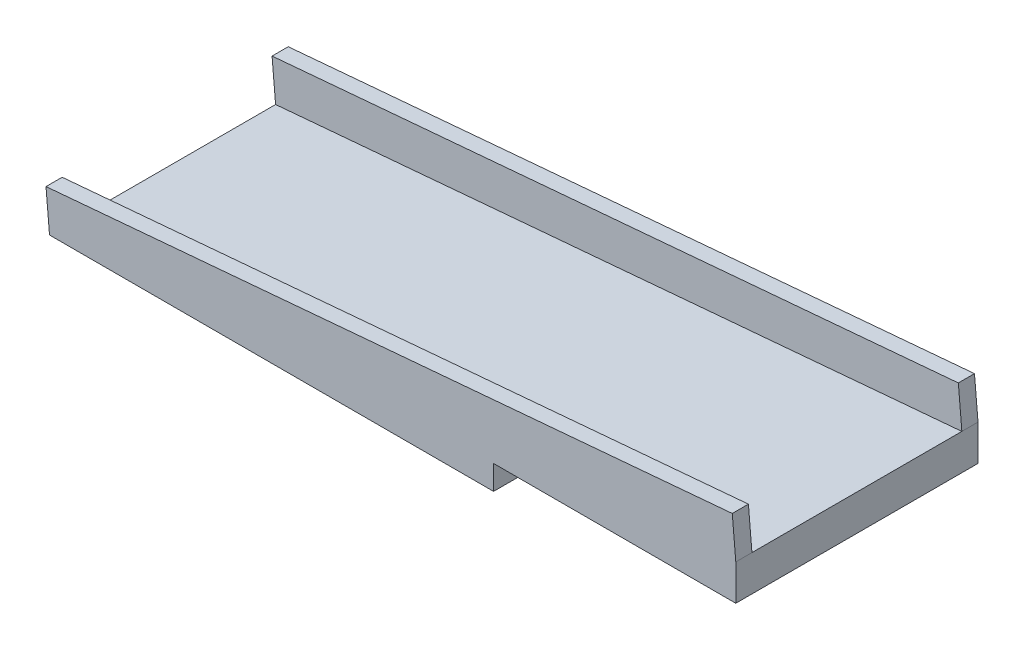
ISO-10303-21;
HEADER;
FILE_DESCRIPTION(('STEP AP214'),'2;1');
FILE_NAME('part.step','',(''),(''),'','','');
FILE_SCHEMA(('AUTOMOTIVE_DESIGN { 1 0 10303 214 1 1 1 1 }'));
ENDSEC;
DATA;
#1=APPLICATION_CONTEXT('core data for automotive mechanical design processes');
#2=APPLICATION_PROTOCOL_DEFINITION('international standard','automotive_design',2000,#1);
#3=PRODUCT_CONTEXT('',#1,'mechanical');
#4=PRODUCT('Part','Part','',(#3));
#5=PRODUCT_RELATED_PRODUCT_CATEGORY('part','',(#4));
#6=PRODUCT_DEFINITION_FORMATION('','',#4);
#7=PRODUCT_DEFINITION_CONTEXT('part definition',#1,'design');
#8=PRODUCT_DEFINITION('design','',#6,#7);
#9=PRODUCT_DEFINITION_SHAPE('','',#8);
#10=(LENGTH_UNIT() NAMED_UNIT(*) SI_UNIT(.MILLI.,.METRE.));
#11=(NAMED_UNIT(*) PLANE_ANGLE_UNIT() SI_UNIT($,.RADIAN.));
#12=(NAMED_UNIT(*) SI_UNIT($,.STERADIAN.) SOLID_ANGLE_UNIT());
#13=UNCERTAINTY_MEASURE_WITH_UNIT(LENGTH_MEASURE(1.E-05),#10,'distance_accuracy_value','');
#14=(GEOMETRIC_REPRESENTATION_CONTEXT(3) GLOBAL_UNCERTAINTY_ASSIGNED_CONTEXT((#13)) GLOBAL_UNIT_ASSIGNED_CONTEXT((#10,
#11,#12)) REPRESENTATION_CONTEXT('',''));
#15=CARTESIAN_POINT('',(0.,0.,0.));
#16=DIRECTION('',(0.,0.,1.));
#17=DIRECTION('',(1.,0.,0.));
#18=AXIS2_PLACEMENT_3D('',#15,#16,#17);
#19=CARTESIAN_POINT('',(-0.329025349508122,3.76077695381245,30.));
#20=DIRECTION('',(0.0871557427476515,-0.996194698091746,0.));
#21=DIRECTION('',(0.996194698091746,0.0871557427476515,0.));
#22=AXIS2_PLACEMENT_3D('',#19,#20,#21);
#23=PLANE('',#22);
#24=DIRECTION('',(0.996194698091746,0.0871557427476516,0.));
#25=VECTOR('',#24,1.);
#26=CARTESIAN_POINT('',(-43.3149026306073,0.,2.));
#27=LINE('',#26,#25);
#28=CARTESIAN_POINT('',(-43.3149026306072,0.,2.));
#29=VERTEX_POINT('',#28);
#30=CARTESIAN_POINT('',(41.6850973693928,7.43653639970297,2.));
#31=VERTEX_POINT('',#30);
#32=EDGE_CURVE('E63',#29,#31,#27,.T.);
#33=ORIENTED_EDGE('',*,*,#32,.F.);
#34=DIRECTION('',(0.,0.,-1.));
#35=VECTOR('',#34,1.);
#36=CARTESIAN_POINT('',(-43.3149026306072,0.,30.));
#37=LINE('',#36,#35);
#38=CARTESIAN_POINT('',(-43.3149026306073,0.,28.));
#39=VERTEX_POINT('',#38);
#40=EDGE_CURVE('E151',#39,#29,#37,.T.);
#41=ORIENTED_EDGE('',*,*,#40,.F.);
#42=DIRECTION('',(-0.996194698091746,-0.0871557427476516,0.));
#43=VECTOR('',#42,1.);
#44=CARTESIAN_POINT('',(-43.3149026306073,0.,28.));
#45=LINE('',#44,#43);
#46=CARTESIAN_POINT('',(41.6850973693928,7.43653639970297,28.));
#47=VERTEX_POINT('',#46);
#48=EDGE_CURVE('E156',#47,#39,#45,.T.);
#49=ORIENTED_EDGE('',*,*,#48,.F.);
#50=DIRECTION('',(0.,0.,-1.));
#51=VECTOR('',#50,1.);
#52=CARTESIAN_POINT('',(41.6850973693928,7.43653639970297,30.));
#53=LINE('',#52,#51);
#54=EDGE_CURVE('E240',#47,#31,#53,.T.);
#55=ORIENTED_EDGE('',*,*,#54,.T.);
#56=EDGE_LOOP('',(#33,#41,#49,#55));
#57=FACE_BOUND('',#56,.T.);
#58=ADVANCED_FACE('F47',(#57),#23,.F.);
#59=CARTESIAN_POINT('',(0.,0.,30.));
#60=DIRECTION('',(0.,1.,0.));
#61=DIRECTION('',(0.,0.,1.));
#62=AXIS2_PLACEMENT_3D('',#59,#60,#61);
#63=PLANE('',#62);
#64=DIRECTION('',(1.,0.,0.));
#65=VECTOR('',#64,1.);
#66=CARTESIAN_POINT('',(0.,0.,0.));
#67=LINE('',#66,#65);
#68=CARTESIAN_POINT('',(-43.3149026306073,0.,0.));
#69=VERTEX_POINT('',#68);
#70=CARTESIAN_POINT('',(11.6850973693928,0.,0.));
#71=VERTEX_POINT('',#70);
#72=EDGE_CURVE('E133',#69,#71,#67,.T.);
#73=ORIENTED_EDGE('',*,*,#72,.T.);
#74=DIRECTION('',(0.,0.,-1.));
#75=VECTOR('',#74,1.);
#76=CARTESIAN_POINT('',(11.6850973693928,0.,30.));
#77=LINE('',#76,#75);
#78=CARTESIAN_POINT('',(11.6850973693928,0.,30.));
#79=VERTEX_POINT('',#78);
#80=EDGE_CURVE('E11',#79,#71,#77,.T.);
#81=ORIENTED_EDGE('',*,*,#80,.F.);
#82=DIRECTION('',(1.,0.,0.));
#83=VECTOR('',#82,1.);
#84=CARTESIAN_POINT('',(0.,0.,30.));
#85=LINE('',#84,#83);
#86=CARTESIAN_POINT('',(-43.3149026306072,0.,30.));
#87=VERTEX_POINT('',#86);
#88=EDGE_CURVE('E214',#87,#79,#85,.T.);
#89=ORIENTED_EDGE('',*,*,#88,.F.);
#90=EDGE_CURVE('E237',#87,#39,#37,.T.);
#91=ORIENTED_EDGE('',*,*,#90,.T.);
#92=ORIENTED_EDGE('',*,*,#40,.T.);
#93=DIRECTION('',(0.,0.,1.));
#94=VECTOR('',#93,1.);
#95=CARTESIAN_POINT('',(-43.3149026306073,0.,0.));
#96=LINE('',#95,#94);
#97=EDGE_CURVE('E149',#69,#29,#96,.T.);
#98=ORIENTED_EDGE('',*,*,#97,.F.);
#99=EDGE_LOOP('',(#73,#81,#89,#91,#92,#98));
#100=FACE_BOUND('',#99,.T.);
#101=ADVANCED_FACE('F49',(#100),#63,.F.);
#102=CARTESIAN_POINT('',(11.6850973693928,0.,30.));
#103=DIRECTION('',(-1.,0.,0.));
#104=DIRECTION('',(0.,0.,1.));
#105=AXIS2_PLACEMENT_3D('',#102,#103,#104);
#106=PLANE('',#105);
#107=DIRECTION('',(0.,1.,0.));
#108=VECTOR('',#107,1.);
#109=CARTESIAN_POINT('',(11.6850973693928,0.,0.));
#110=LINE('',#109,#108);
#111=CARTESIAN_POINT('',(11.6850973693928,3.,0.));
#112=VERTEX_POINT('',#111);
#113=EDGE_CURVE('E142',#71,#112,#110,.T.);
#114=ORIENTED_EDGE('',*,*,#113,.T.);
#115=DIRECTION('',(0.,0.,-1.));
#116=VECTOR('',#115,1.);
#117=CARTESIAN_POINT('',(11.6850973693928,3.,30.));
#118=LINE('',#117,#116);
#119=CARTESIAN_POINT('',(11.6850973693928,3.,30.));
#120=VERTEX_POINT('',#119);
#121=EDGE_CURVE('E56',#120,#112,#118,.T.);
#122=ORIENTED_EDGE('',*,*,#121,.F.);
#123=DIRECTION('',(0.,1.,0.));
#124=VECTOR('',#123,1.);
#125=CARTESIAN_POINT('',(11.6850973693928,0.,30.));
#126=LINE('',#125,#124);
#127=EDGE_CURVE('E218',#79,#120,#126,.T.);
#128=ORIENTED_EDGE('',*,*,#127,.F.);
#129=ORIENTED_EDGE('',*,*,#80,.T.);
#130=EDGE_LOOP('',(#114,#122,#128,#129));
#131=FACE_BOUND('',#130,.T.);
#132=ADVANCED_FACE('F253',(#131),#106,.F.);
#133=CARTESIAN_POINT('',(0.,2.99999999999999,30.));
#134=DIRECTION('',(0.,-1.,0.));
#135=DIRECTION('',(1.,0.,0.));
#136=AXIS2_PLACEMENT_3D('',#133,#134,#135);
#137=PLANE('',#136);
#138=DIRECTION('',(-1.,0.,0.));
#139=VECTOR('',#138,1.);
#140=CARTESIAN_POINT('',(0.,2.99999999999999,0.));
#141=LINE('',#140,#139);
#142=CARTESIAN_POINT('',(41.6850973693928,3.,0.));
#143=VERTEX_POINT('',#142);
#144=EDGE_CURVE('E232',#143,#112,#141,.T.);
#145=ORIENTED_EDGE('',*,*,#144,.F.);
#146=DIRECTION('',(0.,0.,-1.));
#147=VECTOR('',#146,1.);
#148=CARTESIAN_POINT('',(41.6850973693928,3.,30.));
#149=LINE('',#148,#147);
#150=CARTESIAN_POINT('',(41.6850973693928,3.,30.));
#151=VERTEX_POINT('',#150);
#152=EDGE_CURVE('E244',#151,#143,#149,.T.);
#153=ORIENTED_EDGE('',*,*,#152,.F.);
#154=DIRECTION('',(-1.,0.,0.));
#155=VECTOR('',#154,1.);
#156=CARTESIAN_POINT('',(0.,2.99999999999999,30.));
#157=LINE('',#156,#155);
#158=EDGE_CURVE('E222',#151,#120,#157,.T.);
#159=ORIENTED_EDGE('',*,*,#158,.T.);
#160=ORIENTED_EDGE('',*,*,#121,.T.);
#161=EDGE_LOOP('',(#145,#153,#159,#160));
#162=FACE_BOUND('',#161,.T.);
#163=ADVANCED_FACE('F250',(#162),#137,.T.);
#164=CARTESIAN_POINT('',(41.6850973693928,0.,30.));
#165=DIRECTION('',(-1.,0.,0.));
#166=DIRECTION('',(0.,-1.,0.));
#167=AXIS2_PLACEMENT_3D('',#164,#165,#166);
#168=PLANE('',#167);
#169=DIRECTION('',(0.,1.,0.));
#170=VECTOR('',#169,1.);
#171=CARTESIAN_POINT('',(41.6850973693928,0.,0.));
#172=LINE('',#171,#170);
#173=CARTESIAN_POINT('',(41.6850973693928,7.43653639970297,0.));
#174=VERTEX_POINT('',#173);
#175=EDGE_CURVE('E219',#143,#174,#172,.T.);
#176=ORIENTED_EDGE('',*,*,#175,.T.);
#177=DIRECTION('',(0.,0.,-1.));
#178=VECTOR('',#177,1.);
#179=CARTESIAN_POINT('',(41.6850973693928,7.43653639970297,0.));
#180=LINE('',#179,#178);
#181=EDGE_CURVE('E71',#31,#174,#180,.T.);
#182=ORIENTED_EDGE('',*,*,#181,.F.);
#183=ORIENTED_EDGE('',*,*,#54,.F.);
#184=CARTESIAN_POINT('',(41.6850973693928,7.43653639970297,30.));
#185=VERTEX_POINT('',#184);
#186=EDGE_CURVE('E241',#185,#47,#53,.T.);
#187=ORIENTED_EDGE('',*,*,#186,.F.);
#188=DIRECTION('',(0.,1.,0.));
#189=VECTOR('',#188,1.);
#190=CARTESIAN_POINT('',(41.6850973693928,0.,30.));
#191=LINE('',#190,#189);
#192=EDGE_CURVE('E226',#151,#185,#191,.T.);
#193=ORIENTED_EDGE('',*,*,#192,.F.);
#194=ORIENTED_EDGE('',*,*,#152,.T.);
#195=EDGE_LOOP('',(#176,#182,#183,#187,#193,#194));
#196=FACE_BOUND('',#195,.T.);
#197=ADVANCED_FACE('F256',(#196),#168,.F.);
#198=CARTESIAN_POINT('',(0.,0.,30.));
#199=DIRECTION('',(0.,0.,1.));
#200=DIRECTION('',(1.,0.,0.));
#201=AXIS2_PLACEMENT_3D('',#198,#199,#200);
#202=PLANE('',#201);
#203=ORIENTED_EDGE('',*,*,#88,.T.);
#204=ORIENTED_EDGE('',*,*,#127,.T.);
#205=ORIENTED_EDGE('',*,*,#158,.F.);
#206=ORIENTED_EDGE('',*,*,#192,.T.);
#207=DIRECTION('',(0.0871557427476515,-0.996194698091746,0.));
#208=VECTOR('',#207,1.);
#209=CARTESIAN_POINT('',(41.2493186556545,12.4175098901617,30.));
#210=LINE('',#209,#208);
#211=CARTESIAN_POINT('',(41.2493186556545,12.4175098901617,30.));
#212=VERTEX_POINT('',#211);
#213=EDGE_CURVE('E208',#212,#185,#210,.T.);
#214=ORIENTED_EDGE('',*,*,#213,.F.);
#215=DIRECTION('',(0.996194698091746,0.0871557427476516,0.));
#216=VECTOR('',#215,1.);
#217=CARTESIAN_POINT('',(-43.7506813443455,4.98097349045873,30.));
#218=LINE('',#217,#216);
#219=CARTESIAN_POINT('',(-43.7506813443455,4.98097349045873,30.));
#220=VERTEX_POINT('',#219);
#221=EDGE_CURVE('E189',#220,#212,#218,.T.);
#222=ORIENTED_EDGE('',*,*,#221,.F.);
#223=DIRECTION('',(0.0871557427476515,-0.996194698091746,0.));
#224=VECTOR('',#223,1.);
#225=CARTESIAN_POINT('',(-43.7506813443455,4.98097349045873,30.));
#226=LINE('',#225,#224);
#227=EDGE_CURVE('E146',#220,#87,#226,.T.);
#228=ORIENTED_EDGE('',*,*,#227,.T.);
#229=EDGE_LOOP('',(#203,#204,#205,#206,#214,#222,#228));
#230=FACE_BOUND('',#229,.T.);
#231=ADVANCED_FACE('F289',(#230),#202,.T.);
#232=CARTESIAN_POINT('',(0.,0.,0.));
#233=DIRECTION('',(0.,0.,1.));
#234=DIRECTION('',(1.,0.,0.));
#235=AXIS2_PLACEMENT_3D('',#232,#233,#234);
#236=PLANE('',#235);
#237=ORIENTED_EDGE('',*,*,#72,.F.);
#238=DIRECTION('',(0.0871557427476515,-0.996194698091746,0.));
#239=VECTOR('',#238,1.);
#240=CARTESIAN_POINT('',(-43.7506813443455,4.98097349045873,0.));
#241=LINE('',#240,#239);
#242=CARTESIAN_POINT('',(-43.7506813443455,4.98097349045873,0.));
#243=VERTEX_POINT('',#242);
#244=EDGE_CURVE('E138',#243,#69,#241,.T.);
#245=ORIENTED_EDGE('',*,*,#244,.F.);
#246=DIRECTION('',(-0.996194698091746,-0.0871557427476516,0.));
#247=VECTOR('',#246,1.);
#248=CARTESIAN_POINT('',(-43.7506813443455,4.98097349045873,0.));
#249=LINE('',#248,#247);
#250=CARTESIAN_POINT('',(41.2493186556545,12.4175098901617,0.));
#251=VERTEX_POINT('',#250);
#252=EDGE_CURVE('E162',#251,#243,#249,.T.);
#253=ORIENTED_EDGE('',*,*,#252,.F.);
#254=DIRECTION('',(0.0871557427476515,-0.996194698091746,0.));
#255=VECTOR('',#254,1.);
#256=CARTESIAN_POINT('',(41.2493186556545,12.4175098901617,0.));
#257=LINE('',#256,#255);
#258=EDGE_CURVE('E163',#251,#174,#257,.T.);
#259=ORIENTED_EDGE('',*,*,#258,.T.);
#260=ORIENTED_EDGE('',*,*,#175,.F.);
#261=ORIENTED_EDGE('',*,*,#144,.T.);
#262=ORIENTED_EDGE('',*,*,#113,.F.);
#263=EDGE_LOOP('',(#237,#245,#253,#259,#260,#261,#262));
#264=FACE_BOUND('',#263,.T.);
#265=ADVANCED_FACE('F135',(#264),#236,.F.);
#266=CARTESIAN_POINT('',(-43.7506813443455,4.98097349045873,30.));
#267=DIRECTION('',(0.996194698091746,0.0871557427476515,0.));
#268=DIRECTION('',(-0.0871557427476515,0.996194698091746,0.));
#269=AXIS2_PLACEMENT_3D('',#266,#267,#268);
#270=PLANE('',#269);
#271=ORIENTED_EDGE('',*,*,#90,.F.);
#272=ORIENTED_EDGE('',*,*,#227,.F.);
#273=DIRECTION('',(0.,0.,1.));
#274=VECTOR('',#273,1.);
#275=CARTESIAN_POINT('',(-43.7506813443455,4.98097349045873,30.));
#276=LINE('',#275,#274);
#277=CARTESIAN_POINT('',(-43.7506813443455,4.98097349045873,28.));
#278=VERTEX_POINT('',#277);
#279=EDGE_CURVE('E185',#278,#220,#276,.T.);
#280=ORIENTED_EDGE('',*,*,#279,.F.);
#281=DIRECTION('',(0.0871557427476515,-0.996194698091746,0.));
#282=VECTOR('',#281,1.);
#283=CARTESIAN_POINT('',(-43.7506813443455,4.98097349045873,28.));
#284=LINE('',#283,#282);
#285=EDGE_CURVE('E198',#278,#39,#284,.T.);
#286=ORIENTED_EDGE('',*,*,#285,.T.);
#287=EDGE_LOOP('',(#271,#272,#280,#286));
#288=FACE_BOUND('',#287,.T.);
#289=ADVANCED_FACE('F325',(#288),#270,.F.);
#290=CARTESIAN_POINT('',(41.2493186556545,12.4175098901617,30.));
#291=DIRECTION('',(-0.996194698091746,-0.0871557427476515,0.));
#292=DIRECTION('',(0.0871557427476515,-0.996194698091746,0.));
#293=AXIS2_PLACEMENT_3D('',#290,#291,#292);
#294=PLANE('',#293);
#295=ORIENTED_EDGE('',*,*,#186,.T.);
#296=DIRECTION('',(0.0871557427476515,-0.996194698091746,0.));
#297=VECTOR('',#296,1.);
#298=CARTESIAN_POINT('',(41.2493186556545,12.4175098901617,28.));
#299=LINE('',#298,#297);
#300=CARTESIAN_POINT('',(41.2493186556545,12.4175098901617,28.));
#301=VERTEX_POINT('',#300);
#302=EDGE_CURVE('E204',#301,#47,#299,.T.);
#303=ORIENTED_EDGE('',*,*,#302,.F.);
#304=DIRECTION('',(0.,0.,-1.));
#305=VECTOR('',#304,1.);
#306=CARTESIAN_POINT('',(41.2493186556545,12.4175098901617,30.));
#307=LINE('',#306,#305);
#308=EDGE_CURVE('E192',#212,#301,#307,.T.);
#309=ORIENTED_EDGE('',*,*,#308,.F.);
#310=ORIENTED_EDGE('',*,*,#213,.T.);
#311=EDGE_LOOP('',(#295,#303,#309,#310));
#312=FACE_BOUND('',#311,.T.);
#313=ADVANCED_FACE('F338',(#312),#294,.F.);
#314=CARTESIAN_POINT('',(-43.7506813443455,4.98097349045873,28.));
#315=DIRECTION('',(0.,0.,1.));
#316=DIRECTION('',(1.,0.,0.));
#317=AXIS2_PLACEMENT_3D('',#314,#315,#316);
#318=PLANE('',#317);
#319=ORIENTED_EDGE('',*,*,#48,.T.);
#320=ORIENTED_EDGE('',*,*,#285,.F.);
#321=DIRECTION('',(-0.996194698091746,-0.0871557427476516,0.));
#322=VECTOR('',#321,1.);
#323=CARTESIAN_POINT('',(-43.7506813443455,4.98097349045873,28.));
#324=LINE('',#323,#322);
#325=EDGE_CURVE('E195',#301,#278,#324,.T.);
#326=ORIENTED_EDGE('',*,*,#325,.F.);
#327=ORIENTED_EDGE('',*,*,#302,.T.);
#328=EDGE_LOOP('',(#319,#320,#326,#327));
#329=FACE_BOUND('',#328,.T.);
#330=ADVANCED_FACE('F347',(#329),#318,.F.);
#331=CARTESIAN_POINT('',(-0.76480406324638,8.74175044427119,0.));
#332=DIRECTION('',(0.0871557427476516,-0.996194698091746,0.));
#333=DIRECTION('',(0.996194698091746,0.0871557427476516,0.));
#334=AXIS2_PLACEMENT_3D('',#331,#332,#333);
#335=PLANE('',#334);
#336=ORIENTED_EDGE('',*,*,#279,.T.);
#337=ORIENTED_EDGE('',*,*,#221,.T.);
#338=ORIENTED_EDGE('',*,*,#308,.T.);
#339=ORIENTED_EDGE('',*,*,#325,.T.);
#340=EDGE_LOOP('',(#336,#337,#338,#339));
#341=FACE_BOUND('',#340,.T.);
#342=ADVANCED_FACE('F356',(#341),#335,.F.);
#343=CARTESIAN_POINT('',(-43.7506813443455,4.98097349045873,0.));
#344=DIRECTION('',(0.996194698091746,0.0871557427476515,0.));
#345=DIRECTION('',(-0.0871557427476515,0.996194698091746,0.));
#346=AXIS2_PLACEMENT_3D('',#343,#344,#345);
#347=PLANE('',#346);
#348=ORIENTED_EDGE('',*,*,#97,.T.);
#349=DIRECTION('',(0.0871557427476515,-0.996194698091746,0.));
#350=VECTOR('',#349,1.);
#351=CARTESIAN_POINT('',(-43.7506813443455,4.98097349045873,2.));
#352=LINE('',#351,#350);
#353=CARTESIAN_POINT('',(-43.7506813443455,4.98097349045873,2.));
#354=VERTEX_POINT('',#353);
#355=EDGE_CURVE('E265',#354,#29,#352,.T.);
#356=ORIENTED_EDGE('',*,*,#355,.F.);
#357=DIRECTION('',(0.,0.,1.));
#358=VECTOR('',#357,1.);
#359=CARTESIAN_POINT('',(-43.7506813443455,4.98097349045873,0.));
#360=LINE('',#359,#358);
#361=EDGE_CURVE('E160',#243,#354,#360,.T.);
#362=ORIENTED_EDGE('',*,*,#361,.F.);
#363=ORIENTED_EDGE('',*,*,#244,.T.);
#364=EDGE_LOOP('',(#348,#356,#362,#363));
#365=FACE_BOUND('',#364,.T.);
#366=ADVANCED_FACE('F158',(#365),#347,.F.);
#367=CARTESIAN_POINT('',(-43.7506813443455,4.98097349045873,2.));
#368=DIRECTION('',(0.,0.,-1.));
#369=DIRECTION('',(-1.,0.,0.));
#370=AXIS2_PLACEMENT_3D('',#367,#368,#369);
#371=PLANE('',#370);
#372=ORIENTED_EDGE('',*,*,#32,.T.);
#373=DIRECTION('',(0.0871557427476515,-0.996194698091746,0.));
#374=VECTOR('',#373,1.);
#375=CARTESIAN_POINT('',(41.2493186556545,12.4175098901617,2.));
#376=LINE('',#375,#374);
#377=CARTESIAN_POINT('',(41.2493186556545,12.4175098901617,2.));
#378=VERTEX_POINT('',#377);
#379=EDGE_CURVE('E170',#378,#31,#376,.T.);
#380=ORIENTED_EDGE('',*,*,#379,.F.);
#381=DIRECTION('',(0.996194698091746,0.0871557427476516,0.));
#382=VECTOR('',#381,1.);
#383=CARTESIAN_POINT('',(-43.7506813443455,4.98097349045873,2.));
#384=LINE('',#383,#382);
#385=EDGE_CURVE('E180',#354,#378,#384,.T.);
#386=ORIENTED_EDGE('',*,*,#385,.F.);
#387=ORIENTED_EDGE('',*,*,#355,.T.);
#388=EDGE_LOOP('',(#372,#380,#386,#387));
#389=FACE_BOUND('',#388,.T.);
#390=ADVANCED_FACE('F268',(#389),#371,.F.);
#391=CARTESIAN_POINT('',(41.2493186556545,12.4175098901617,0.));
#392=DIRECTION('',(-0.996194698091746,-0.0871557427476515,0.));
#393=DIRECTION('',(0.0871557427476515,-0.996194698091746,0.));
#394=AXIS2_PLACEMENT_3D('',#391,#392,#393);
#395=PLANE('',#394);
#396=ORIENTED_EDGE('',*,*,#181,.T.);
#397=ORIENTED_EDGE('',*,*,#258,.F.);
#398=DIRECTION('',(0.,0.,-1.));
#399=VECTOR('',#398,1.);
#400=CARTESIAN_POINT('',(41.2493186556545,12.4175098901617,0.));
#401=LINE('',#400,#399);
#402=EDGE_CURVE('E167',#378,#251,#401,.T.);
#403=ORIENTED_EDGE('',*,*,#402,.F.);
#404=ORIENTED_EDGE('',*,*,#379,.T.);
#405=EDGE_LOOP('',(#396,#397,#403,#404));
#406=FACE_BOUND('',#405,.T.);
#407=ADVANCED_FACE('F260',(#406),#395,.F.);
#408=CARTESIAN_POINT('',(-0.76480406324638,8.74175044427119,0.));
#409=DIRECTION('',(-0.0871557427476516,0.996194698091746,0.));
#410=DIRECTION('',(-0.996194698091746,-0.0871557427476516,0.));
#411=AXIS2_PLACEMENT_3D('',#408,#409,#410);
#412=PLANE('',#411);
#413=ORIENTED_EDGE('',*,*,#361,.T.);
#414=ORIENTED_EDGE('',*,*,#385,.T.);
#415=ORIENTED_EDGE('',*,*,#402,.T.);
#416=ORIENTED_EDGE('',*,*,#252,.T.);
#417=EDGE_LOOP('',(#413,#414,#415,#416));
#418=FACE_BOUND('',#417,.T.);
#419=ADVANCED_FACE('F270',(#418),#412,.T.);
#420=CLOSED_SHELL('',(#58,#101,#132,#163,#197,#231,#265,#289,#313,#330,#342,#366,#390,#407,#419));
#421=MANIFOLD_SOLID_BREP('B2',#420);
#422=ADVANCED_BREP_SHAPE_REPRESENTATION('',(#18,#421),#14);
#423=SHAPE_DEFINITION_REPRESENTATION(#9,#422);
ENDSEC;
END-ISO-10303-21;
